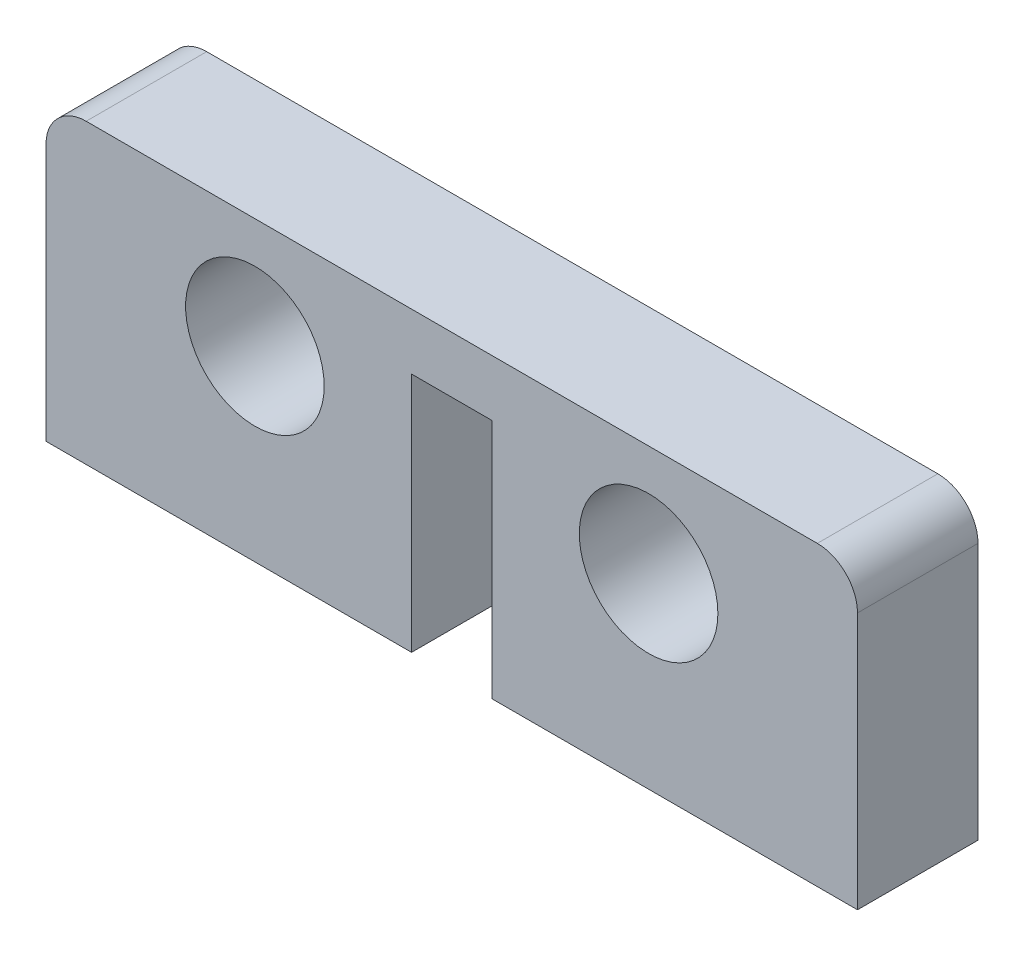
ISO-10303-21;
HEADER;
FILE_DESCRIPTION(('STEP AP214'),'2;1');
FILE_NAME('part.step','',(''),(''),'','','');
FILE_SCHEMA(('AUTOMOTIVE_DESIGN { 1 0 10303 214 1 1 1 1 }'));
ENDSEC;
DATA;
#1=APPLICATION_CONTEXT('core data for automotive mechanical design processes');
#2=APPLICATION_PROTOCOL_DEFINITION('international standard','automotive_design',2000,#1);
#3=PRODUCT_CONTEXT('',#1,'mechanical');
#4=PRODUCT('Part','Part','',(#3));
#5=PRODUCT_RELATED_PRODUCT_CATEGORY('part','',(#4));
#6=PRODUCT_DEFINITION_FORMATION('','',#4);
#7=PRODUCT_DEFINITION_CONTEXT('part definition',#1,'design');
#8=PRODUCT_DEFINITION('design','',#6,#7);
#9=PRODUCT_DEFINITION_SHAPE('','',#8);
#10=(LENGTH_UNIT() NAMED_UNIT(*) SI_UNIT(.MILLI.,.METRE.));
#11=(NAMED_UNIT(*) PLANE_ANGLE_UNIT() SI_UNIT($,.RADIAN.));
#12=(NAMED_UNIT(*) SI_UNIT($,.STERADIAN.) SOLID_ANGLE_UNIT());
#13=UNCERTAINTY_MEASURE_WITH_UNIT(LENGTH_MEASURE(1.E-05),#10,'distance_accuracy_value','');
#14=(GEOMETRIC_REPRESENTATION_CONTEXT(3) GLOBAL_UNCERTAINTY_ASSIGNED_CONTEXT((#13)) GLOBAL_UNIT_ASSIGNED_CONTEXT((#10,
#11,#12)) REPRESENTATION_CONTEXT('',''));
#15=CARTESIAN_POINT('',(0.,0.,0.));
#16=DIRECTION('',(0.,0.,1.));
#17=DIRECTION('',(1.,0.,0.));
#18=AXIS2_PLACEMENT_3D('',#15,#16,#17);
#19=CARTESIAN_POINT('',(-10.1,-3.7,3.));
#20=DIRECTION('',(0.,1.,0.));
#21=DIRECTION('',(0.,0.,1.));
#22=AXIS2_PLACEMENT_3D('',#19,#20,#21);
#23=PLANE('',#22);
#24=DIRECTION('',(1.,0.,0.));
#25=VECTOR('',#24,1.);
#26=CARTESIAN_POINT('',(-10.1,-3.7,0.));
#27=LINE('',#26,#25);
#28=CARTESIAN_POINT('',(-10.1,-3.7,0.));
#29=VERTEX_POINT('',#28);
#30=CARTESIAN_POINT('',(-0.999999999999999,-3.7,0.));
#31=VERTEX_POINT('',#30);
#32=EDGE_CURVE('E133',#29,#31,#27,.T.);
#33=ORIENTED_EDGE('',*,*,#32,.T.);
#34=DIRECTION('',(0.,0.,1.));
#35=VECTOR('',#34,1.);
#36=CARTESIAN_POINT('',(-0.999999999999999,-3.7,0.));
#37=LINE('',#36,#35);
#38=CARTESIAN_POINT('',(-0.999999999999999,-3.7,3.));
#39=VERTEX_POINT('',#38);
#40=EDGE_CURVE('E113',#31,#39,#37,.T.);
#41=ORIENTED_EDGE('',*,*,#40,.T.);
#42=DIRECTION('',(1.,0.,0.));
#43=VECTOR('',#42,1.);
#44=CARTESIAN_POINT('',(-10.1,-3.7,3.));
#45=LINE('',#44,#43);
#46=CARTESIAN_POINT('',(-10.1,-3.7,3.));
#47=VERTEX_POINT('',#46);
#48=EDGE_CURVE('E217',#47,#39,#45,.T.);
#49=ORIENTED_EDGE('',*,*,#48,.F.);
#50=DIRECTION('',(0.,0.,-1.));
#51=VECTOR('',#50,1.);
#52=CARTESIAN_POINT('',(-10.1,-3.7,3.));
#53=LINE('',#52,#51);
#54=EDGE_CURVE('E141',#47,#29,#53,.T.);
#55=ORIENTED_EDGE('',*,*,#54,.T.);
#56=EDGE_LOOP('',(#33,#41,#49,#55));
#57=FACE_BOUND('',#56,.T.);
#58=ADVANCED_FACE('F33',(#57),#23,.F.);
#59=CARTESIAN_POINT('',(0.,0.,3.));
#60=DIRECTION('',(0.,0.,1.));
#61=DIRECTION('',(1.,0.,0.));
#62=AXIS2_PLACEMENT_3D('',#59,#60,#61);
#63=PLANE('',#62);
#64=DIRECTION('',(0.,1.,0.));
#65=VECTOR('',#64,1.);
#66=CARTESIAN_POINT('',(10.1,3.7,3.));
#67=LINE('',#66,#65);
#68=CARTESIAN_POINT('',(10.1,-3.7,3.));
#69=VERTEX_POINT('',#68);
#70=CARTESIAN_POINT('',(10.1,2.7,3.));
#71=VERTEX_POINT('',#70);
#72=EDGE_CURVE('E173',#69,#71,#67,.T.);
#73=ORIENTED_EDGE('',*,*,#72,.T.);
#74=CARTESIAN_POINT('',(9.1,2.7,3.));
#75=DIRECTION('',(0.,0.,1.));
#76=DIRECTION('',(1.,0.,0.));
#77=AXIS2_PLACEMENT_3D('',#74,#75,#76);
#78=CIRCLE('',#77,1.);
#79=CARTESIAN_POINT('',(9.1,3.7,3.));
#80=VERTEX_POINT('',#79);
#81=EDGE_CURVE('E41',#71,#80,#78,.T.);
#82=ORIENTED_EDGE('',*,*,#81,.T.);
#83=DIRECTION('',(-1.,0.,0.));
#84=VECTOR('',#83,1.);
#85=CARTESIAN_POINT('',(-10.1,3.7,3.));
#86=LINE('',#85,#84);
#87=CARTESIAN_POINT('',(-9.1,3.7,3.));
#88=VERTEX_POINT('',#87);
#89=EDGE_CURVE('E157',#80,#88,#86,.T.);
#90=ORIENTED_EDGE('',*,*,#89,.T.);
#91=CARTESIAN_POINT('',(-9.1,2.7,3.));
#92=DIRECTION('',(0.,0.,1.));
#93=DIRECTION('',(1.,0.,0.));
#94=AXIS2_PLACEMENT_3D('',#91,#92,#93);
#95=CIRCLE('',#94,1.);
#96=CARTESIAN_POINT('',(-10.1,2.7,3.));
#97=VERTEX_POINT('',#96);
#98=EDGE_CURVE('E48',#88,#97,#95,.T.);
#99=ORIENTED_EDGE('',*,*,#98,.T.);
#100=DIRECTION('',(0.,-1.,0.));
#101=VECTOR('',#100,1.);
#102=CARTESIAN_POINT('',(-10.1,3.7,3.));
#103=LINE('',#102,#101);
#104=EDGE_CURVE('E153',#97,#47,#103,.T.);
#105=ORIENTED_EDGE('',*,*,#104,.T.);
#106=ORIENTED_EDGE('',*,*,#48,.T.);
#107=DIRECTION('',(0.,-1.,0.));
#108=VECTOR('',#107,1.);
#109=CARTESIAN_POINT('',(-0.999999999999999,-3.7,3.));
#110=LINE('',#109,#108);
#111=CARTESIAN_POINT('',(-0.999999999999999,2.3,3.));
#112=VERTEX_POINT('',#111);
#113=EDGE_CURVE('E119',#112,#39,#110,.T.);
#114=ORIENTED_EDGE('',*,*,#113,.F.);
#115=DIRECTION('',(-1.,0.,0.));
#116=VECTOR('',#115,1.);
#117=CARTESIAN_POINT('',(-0.999999999999999,2.3,3.));
#118=LINE('',#117,#116);
#119=CARTESIAN_POINT('',(1.,2.3,3.));
#120=VERTEX_POINT('',#119);
#121=EDGE_CURVE('E138',#120,#112,#118,.T.);
#122=ORIENTED_EDGE('',*,*,#121,.F.);
#123=DIRECTION('',(0.,1.,0.));
#124=VECTOR('',#123,1.);
#125=CARTESIAN_POINT('',(1.,-3.7,3.));
#126=LINE('',#125,#124);
#127=CARTESIAN_POINT('',(1.,-3.7,3.));
#128=VERTEX_POINT('',#127);
#129=EDGE_CURVE('E194',#128,#120,#126,.T.);
#130=ORIENTED_EDGE('',*,*,#129,.F.);
#131=EDGE_CURVE('E188',#128,#69,#45,.T.);
#132=ORIENTED_EDGE('',*,*,#131,.T.);
#133=EDGE_LOOP('',(#73,#82,#90,#99,#105,#106,#114,#122,#130,#132));
#134=FACE_BOUND('',#133,.T.);
#135=CARTESIAN_POINT('',(-4.9,0.95,3.));
#136=DIRECTION('',(0.,0.,1.));
#137=DIRECTION('',(1.,0.,0.));
#138=AXIS2_PLACEMENT_3D('',#135,#136,#137);
#139=CIRCLE('',#138,1.725);
#140=CARTESIAN_POINT('',(-3.175,0.95,3.));
#141=VERTEX_POINT('',#140);
#142=EDGE_CURVE('E211',#141,#141,#139,.T.);
#143=ORIENTED_EDGE('',*,*,#142,.F.);
#144=EDGE_LOOP('',(#143));
#145=FACE_BOUND('',#144,.T.);
#146=CARTESIAN_POINT('',(4.9,0.950000000000002,3.));
#147=DIRECTION('',(0.,0.,1.));
#148=DIRECTION('',(1.,0.,0.));
#149=AXIS2_PLACEMENT_3D('',#146,#147,#148);
#150=CIRCLE('',#149,1.725);
#151=CARTESIAN_POINT('',(6.625,0.950000000000002,3.));
#152=VERTEX_POINT('',#151);
#153=EDGE_CURVE('E205',#152,#152,#150,.T.);
#154=ORIENTED_EDGE('',*,*,#153,.F.);
#155=EDGE_LOOP('',(#154));
#156=FACE_BOUND('',#155,.T.);
#157=ADVANCED_FACE('F171',(#134,#145,#156),#63,.T.);
#158=CARTESIAN_POINT('',(0.,0.,0.));
#159=DIRECTION('',(0.,0.,1.));
#160=DIRECTION('',(1.,0.,0.));
#161=AXIS2_PLACEMENT_3D('',#158,#159,#160);
#162=PLANE('',#161);
#163=CARTESIAN_POINT('',(-4.9,0.95,0.));
#164=DIRECTION('',(0.,0.,1.));
#165=DIRECTION('',(1.,0.,0.));
#166=AXIS2_PLACEMENT_3D('',#163,#164,#165);
#167=CIRCLE('',#166,1.725);
#168=CARTESIAN_POINT('',(-3.175,0.95,0.));
#169=VERTEX_POINT('',#168);
#170=EDGE_CURVE('E208',#169,#169,#167,.T.);
#171=ORIENTED_EDGE('',*,*,#170,.T.);
#172=EDGE_LOOP('',(#171));
#173=FACE_BOUND('',#172,.T.);
#174=DIRECTION('',(-1.,0.,0.));
#175=VECTOR('',#174,1.);
#176=CARTESIAN_POINT('',(-10.1,3.7,0.));
#177=LINE('',#176,#175);
#178=CARTESIAN_POINT('',(9.1,3.7,0.));
#179=VERTEX_POINT('',#178);
#180=CARTESIAN_POINT('',(-9.1,3.7,0.));
#181=VERTEX_POINT('',#180);
#182=EDGE_CURVE('E145',#179,#181,#177,.T.);
#183=ORIENTED_EDGE('',*,*,#182,.F.);
#184=CARTESIAN_POINT('',(9.1,2.7,0.));
#185=DIRECTION('',(0.,0.,1.));
#186=DIRECTION('',(1.,0.,0.));
#187=AXIS2_PLACEMENT_3D('',#184,#185,#186);
#188=CIRCLE('',#187,1.);
#189=CARTESIAN_POINT('',(10.1,2.7,0.));
#190=VERTEX_POINT('',#189);
#191=EDGE_CURVE('E166',#179,#190,#188,.F.);
#192=ORIENTED_EDGE('',*,*,#191,.T.);
#193=DIRECTION('',(0.,1.,0.));
#194=VECTOR('',#193,1.);
#195=CARTESIAN_POINT('',(10.1,3.7,0.));
#196=LINE('',#195,#194);
#197=CARTESIAN_POINT('',(10.1,-3.7,0.));
#198=VERTEX_POINT('',#197);
#199=EDGE_CURVE('E142',#198,#190,#196,.T.);
#200=ORIENTED_EDGE('',*,*,#199,.F.);
#201=CARTESIAN_POINT('',(1.,-3.7,0.));
#202=VERTEX_POINT('',#201);
#203=EDGE_CURVE('E143',#202,#198,#27,.T.);
#204=ORIENTED_EDGE('',*,*,#203,.F.);
#205=DIRECTION('',(0.,1.,0.));
#206=VECTOR('',#205,1.);
#207=CARTESIAN_POINT('',(1.,-3.7,0.));
#208=LINE('',#207,#206);
#209=CARTESIAN_POINT('',(1.,2.3,0.));
#210=VERTEX_POINT('',#209);
#211=EDGE_CURVE('E137',#202,#210,#208,.T.);
#212=ORIENTED_EDGE('',*,*,#211,.T.);
#213=DIRECTION('',(-1.,0.,0.));
#214=VECTOR('',#213,1.);
#215=CARTESIAN_POINT('',(-0.999999999999999,2.3,0.));
#216=LINE('',#215,#214);
#217=CARTESIAN_POINT('',(-0.999999999999999,2.3,0.));
#218=VERTEX_POINT('',#217);
#219=EDGE_CURVE('E125',#210,#218,#216,.T.);
#220=ORIENTED_EDGE('',*,*,#219,.T.);
#221=DIRECTION('',(0.,-1.,0.));
#222=VECTOR('',#221,1.);
#223=CARTESIAN_POINT('',(-0.999999999999999,-3.7,0.));
#224=LINE('',#223,#222);
#225=EDGE_CURVE('E116',#218,#31,#224,.T.);
#226=ORIENTED_EDGE('',*,*,#225,.T.);
#227=ORIENTED_EDGE('',*,*,#32,.F.);
#228=DIRECTION('',(0.,-1.,0.));
#229=VECTOR('',#228,1.);
#230=CARTESIAN_POINT('',(-10.1,3.7,0.));
#231=LINE('',#230,#229);
#232=CARTESIAN_POINT('',(-10.1,2.7,0.));
#233=VERTEX_POINT('',#232);
#234=EDGE_CURVE('E147',#233,#29,#231,.T.);
#235=ORIENTED_EDGE('',*,*,#234,.F.);
#236=CARTESIAN_POINT('',(-9.1,2.7,0.));
#237=DIRECTION('',(0.,0.,1.));
#238=DIRECTION('',(1.,0.,0.));
#239=AXIS2_PLACEMENT_3D('',#236,#237,#238);
#240=CIRCLE('',#239,1.);
#241=EDGE_CURVE('E164',#233,#181,#240,.F.);
#242=ORIENTED_EDGE('',*,*,#241,.T.);
#243=EDGE_LOOP('',(#183,#192,#200,#204,#212,#220,#226,#227,#235,#242));
#244=FACE_BOUND('',#243,.T.);
#245=CARTESIAN_POINT('',(4.9,0.950000000000002,0.));
#246=DIRECTION('',(0.,0.,1.));
#247=DIRECTION('',(1.,0.,0.));
#248=AXIS2_PLACEMENT_3D('',#245,#246,#247);
#249=CIRCLE('',#248,1.725);
#250=CARTESIAN_POINT('',(6.625,0.950000000000002,0.));
#251=VERTEX_POINT('',#250);
#252=EDGE_CURVE('E201',#251,#251,#249,.T.);
#253=ORIENTED_EDGE('',*,*,#252,.T.);
#254=EDGE_LOOP('',(#253));
#255=FACE_BOUND('',#254,.T.);
#256=ADVANCED_FACE('F130',(#173,#244,#255),#162,.F.);
#257=CARTESIAN_POINT('',(-10.1,3.7,3.));
#258=DIRECTION('',(1.,0.,0.));
#259=DIRECTION('',(0.,0.,-1.));
#260=AXIS2_PLACEMENT_3D('',#257,#258,#259);
#261=PLANE('',#260);
#262=ORIENTED_EDGE('',*,*,#104,.F.);
#263=DIRECTION('',(0.,0.,-1.));
#264=VECTOR('',#263,1.);
#265=CARTESIAN_POINT('',(-10.1,2.7,3.));
#266=LINE('',#265,#264);
#267=EDGE_CURVE('E11',#97,#233,#266,.T.);
#268=ORIENTED_EDGE('',*,*,#267,.T.);
#269=ORIENTED_EDGE('',*,*,#234,.T.);
#270=ORIENTED_EDGE('',*,*,#54,.F.);
#271=EDGE_LOOP('',(#262,#268,#269,#270));
#272=FACE_BOUND('',#271,.T.);
#273=ADVANCED_FACE('F242',(#272),#261,.F.);
#274=ORIENTED_EDGE('',*,*,#131,.F.);
#275=DIRECTION('',(0.,0.,1.));
#276=VECTOR('',#275,1.);
#277=CARTESIAN_POINT('',(1.,-3.7,0.));
#278=LINE('',#277,#276);
#279=EDGE_CURVE('E124',#202,#128,#278,.T.);
#280=ORIENTED_EDGE('',*,*,#279,.F.);
#281=ORIENTED_EDGE('',*,*,#203,.T.);
#282=DIRECTION('',(0.,0.,-1.));
#283=VECTOR('',#282,1.);
#284=CARTESIAN_POINT('',(10.1,-3.7,3.));
#285=LINE('',#284,#283);
#286=EDGE_CURVE('E154',#69,#198,#285,.T.);
#287=ORIENTED_EDGE('',*,*,#286,.F.);
#288=EDGE_LOOP('',(#274,#280,#281,#287));
#289=FACE_BOUND('',#288,.T.);
#290=ADVANCED_FACE('F186',(#289),#23,.F.);
#291=CARTESIAN_POINT('',(10.1,3.7,3.));
#292=DIRECTION('',(-1.,0.,0.));
#293=DIRECTION('',(0.,0.,1.));
#294=AXIS2_PLACEMENT_3D('',#291,#292,#293);
#295=PLANE('',#294);
#296=ORIENTED_EDGE('',*,*,#199,.T.);
#297=DIRECTION('',(0.,0.,-1.));
#298=VECTOR('',#297,1.);
#299=CARTESIAN_POINT('',(10.1,2.7,3.));
#300=LINE('',#299,#298);
#301=EDGE_CURVE('E56',#190,#71,#300,.F.);
#302=ORIENTED_EDGE('',*,*,#301,.T.);
#303=ORIENTED_EDGE('',*,*,#72,.F.);
#304=ORIENTED_EDGE('',*,*,#286,.T.);
#305=EDGE_LOOP('',(#296,#302,#303,#304));
#306=FACE_BOUND('',#305,.T.);
#307=ADVANCED_FACE('F182',(#306),#295,.F.);
#308=CARTESIAN_POINT('',(-10.1,3.7,3.));
#309=DIRECTION('',(0.,-1.,0.));
#310=DIRECTION('',(0.,0.,-1.));
#311=AXIS2_PLACEMENT_3D('',#308,#309,#310);
#312=PLANE('',#311);
#313=ORIENTED_EDGE('',*,*,#89,.F.);
#314=DIRECTION('',(0.,0.,-1.));
#315=VECTOR('',#314,1.);
#316=CARTESIAN_POINT('',(9.1,3.7,3.));
#317=LINE('',#316,#315);
#318=EDGE_CURVE('E161',#80,#179,#317,.T.);
#319=ORIENTED_EDGE('',*,*,#318,.T.);
#320=ORIENTED_EDGE('',*,*,#182,.T.);
#321=DIRECTION('',(0.,0.,-1.));
#322=VECTOR('',#321,1.);
#323=CARTESIAN_POINT('',(-9.1,3.7,3.));
#324=LINE('',#323,#322);
#325=EDGE_CURVE('E159',#181,#88,#324,.F.);
#326=ORIENTED_EDGE('',*,*,#325,.T.);
#327=EDGE_LOOP('',(#313,#319,#320,#326));
#328=FACE_BOUND('',#327,.T.);
#329=ADVANCED_FACE('F177',(#328),#312,.F.);
#330=CARTESIAN_POINT('',(-4.9,0.95,3.));
#331=DIRECTION('',(0.,0.,-1.));
#332=DIRECTION('',(-1.,0.,0.));
#333=AXIS2_PLACEMENT_3D('',#330,#331,#332);
#334=CYLINDRICAL_SURFACE('',#333,1.725);
#335=ORIENTED_EDGE('',*,*,#142,.T.);
#336=EDGE_LOOP('',(#335));
#337=FACE_BOUND('',#336,.T.);
#338=ORIENTED_EDGE('',*,*,#170,.F.);
#339=EDGE_LOOP('',(#338));
#340=FACE_BOUND('',#339,.T.);
#341=ADVANCED_FACE('F275',(#337,#340),#334,.F.);
#342=CARTESIAN_POINT('',(4.9,0.950000000000002,3.));
#343=DIRECTION('',(0.,0.,-1.));
#344=DIRECTION('',(-1.,0.,0.));
#345=AXIS2_PLACEMENT_3D('',#342,#343,#344);
#346=CYLINDRICAL_SURFACE('',#345,1.725);
#347=ORIENTED_EDGE('',*,*,#153,.T.);
#348=EDGE_LOOP('',(#347));
#349=FACE_BOUND('',#348,.T.);
#350=ORIENTED_EDGE('',*,*,#252,.F.);
#351=EDGE_LOOP('',(#350));
#352=FACE_BOUND('',#351,.T.);
#353=ADVANCED_FACE('F231',(#349,#352),#346,.F.);
#354=CARTESIAN_POINT('',(-0.999999999999999,-3.7,0.));
#355=DIRECTION('',(-1.,0.,0.));
#356=DIRECTION('',(0.,0.,1.));
#357=AXIS2_PLACEMENT_3D('',#354,#355,#356);
#358=PLANE('',#357);
#359=ORIENTED_EDGE('',*,*,#113,.T.);
#360=ORIENTED_EDGE('',*,*,#40,.F.);
#361=ORIENTED_EDGE('',*,*,#225,.F.);
#362=DIRECTION('',(0.,0.,1.));
#363=VECTOR('',#362,1.);
#364=CARTESIAN_POINT('',(-0.999999999999999,2.3,0.));
#365=LINE('',#364,#363);
#366=EDGE_CURVE('E199',#218,#112,#365,.T.);
#367=ORIENTED_EDGE('',*,*,#366,.T.);
#368=EDGE_LOOP('',(#359,#360,#361,#367));
#369=FACE_BOUND('',#368,.T.);
#370=ADVANCED_FACE('F115',(#369),#358,.F.);
#371=CARTESIAN_POINT('',(-0.999999999999999,2.3,0.));
#372=DIRECTION('',(0.,1.,0.));
#373=DIRECTION('',(0.,0.,1.));
#374=AXIS2_PLACEMENT_3D('',#371,#372,#373);
#375=PLANE('',#374);
#376=ORIENTED_EDGE('',*,*,#121,.T.);
#377=ORIENTED_EDGE('',*,*,#366,.F.);
#378=ORIENTED_EDGE('',*,*,#219,.F.);
#379=DIRECTION('',(0.,0.,1.));
#380=VECTOR('',#379,1.);
#381=CARTESIAN_POINT('',(1.,2.3,0.));
#382=LINE('',#381,#380);
#383=EDGE_CURVE('E202',#210,#120,#382,.T.);
#384=ORIENTED_EDGE('',*,*,#383,.T.);
#385=EDGE_LOOP('',(#376,#377,#378,#384));
#386=FACE_BOUND('',#385,.T.);
#387=ADVANCED_FACE('F223',(#386),#375,.F.);
#388=CARTESIAN_POINT('',(1.,-3.7,0.));
#389=DIRECTION('',(1.,0.,0.));
#390=DIRECTION('',(0.,1.,0.));
#391=AXIS2_PLACEMENT_3D('',#388,#389,#390);
#392=PLANE('',#391);
#393=ORIENTED_EDGE('',*,*,#129,.T.);
#394=ORIENTED_EDGE('',*,*,#383,.F.);
#395=ORIENTED_EDGE('',*,*,#211,.F.);
#396=ORIENTED_EDGE('',*,*,#279,.T.);
#397=EDGE_LOOP('',(#393,#394,#395,#396));
#398=FACE_BOUND('',#397,.T.);
#399=ADVANCED_FACE('F221',(#398),#392,.F.);
#400=CARTESIAN_POINT('',(9.1,2.7,3.));
#401=DIRECTION('',(0.,0.,-1.));
#402=DIRECTION('',(-1.,0.,0.));
#403=AXIS2_PLACEMENT_3D('',#400,#401,#402);
#404=CYLINDRICAL_SURFACE('',#403,1.);
#405=ORIENTED_EDGE('',*,*,#81,.F.);
#406=ORIENTED_EDGE('',*,*,#301,.F.);
#407=ORIENTED_EDGE('',*,*,#191,.F.);
#408=ORIENTED_EDGE('',*,*,#318,.F.);
#409=EDGE_LOOP('',(#405,#406,#407,#408));
#410=FACE_BOUND('',#409,.T.);
#411=ADVANCED_FACE('F179',(#410),#404,.T.);
#412=CARTESIAN_POINT('',(-9.1,2.7,3.));
#413=DIRECTION('',(0.,0.,-1.));
#414=DIRECTION('',(-1.,0.,0.));
#415=AXIS2_PLACEMENT_3D('',#412,#413,#414);
#416=CYLINDRICAL_SURFACE('',#415,1.);
#417=ORIENTED_EDGE('',*,*,#98,.F.);
#418=ORIENTED_EDGE('',*,*,#325,.F.);
#419=ORIENTED_EDGE('',*,*,#241,.F.);
#420=ORIENTED_EDGE('',*,*,#267,.F.);
#421=EDGE_LOOP('',(#417,#418,#419,#420));
#422=FACE_BOUND('',#421,.T.);
#423=ADVANCED_FACE('F35',(#422),#416,.T.);
#424=CLOSED_SHELL('',(#58,#157,#256,#273,#290,#307,#329,#341,#353,#370,#387,#399,#411,#423));
#425=MANIFOLD_SOLID_BREP('B2',#424);
#426=ADVANCED_BREP_SHAPE_REPRESENTATION('',(#18,#425),#14);
#427=SHAPE_DEFINITION_REPRESENTATION(#9,#426);
ENDSEC;
END-ISO-10303-21;
